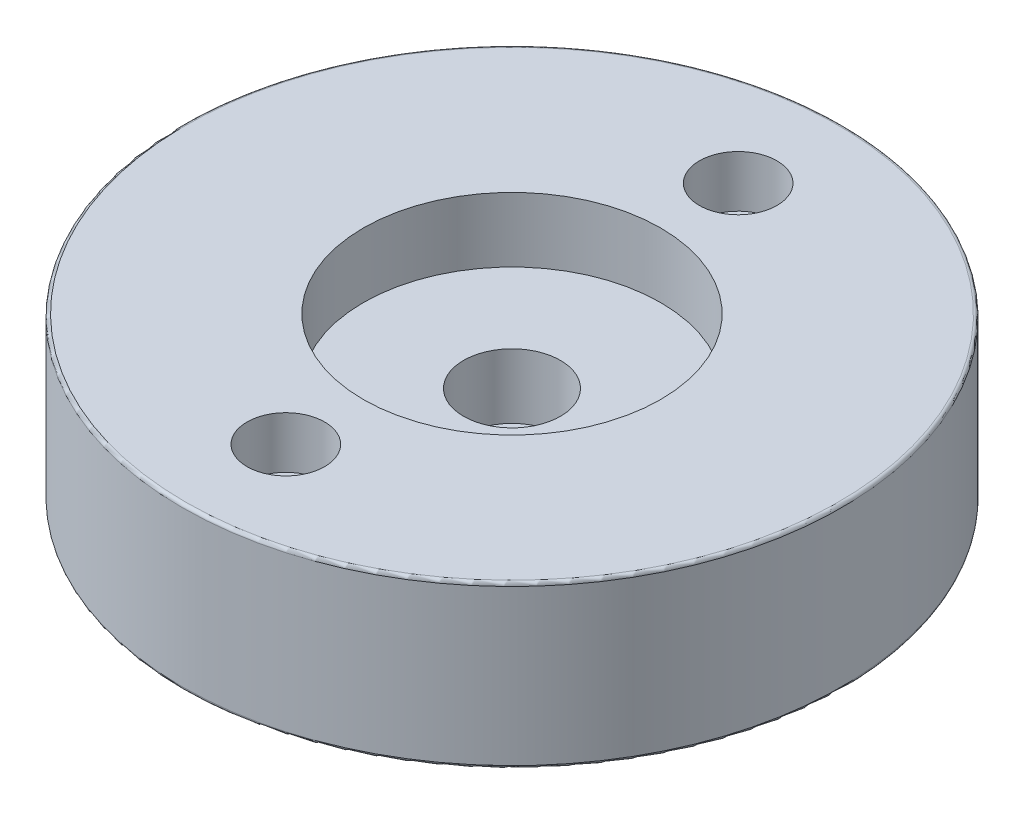
ISO-10303-21;
HEADER;
FILE_DESCRIPTION(('STEP AP214'),'2;1');
FILE_NAME('part.step','',(''),(''),'','','');
FILE_SCHEMA(('AUTOMOTIVE_DESIGN { 1 0 10303 214 1 1 1 1 }'));
ENDSEC;
DATA;
#1=APPLICATION_CONTEXT('core data for automotive mechanical design processes');
#2=APPLICATION_PROTOCOL_DEFINITION('international standard','automotive_design',2000,#1);
#3=PRODUCT_CONTEXT('',#1,'mechanical');
#4=PRODUCT('Part','Part','',(#3));
#5=PRODUCT_RELATED_PRODUCT_CATEGORY('part','',(#4));
#6=PRODUCT_DEFINITION_FORMATION('','',#4);
#7=PRODUCT_DEFINITION_CONTEXT('part definition',#1,'design');
#8=PRODUCT_DEFINITION('design','',#6,#7);
#9=PRODUCT_DEFINITION_SHAPE('','',#8);
#10=(LENGTH_UNIT() NAMED_UNIT(*) SI_UNIT(.MILLI.,.METRE.));
#11=(NAMED_UNIT(*) PLANE_ANGLE_UNIT() SI_UNIT($,.RADIAN.));
#12=(NAMED_UNIT(*) SI_UNIT($,.STERADIAN.) SOLID_ANGLE_UNIT());
#13=UNCERTAINTY_MEASURE_WITH_UNIT(LENGTH_MEASURE(1.E-05),#10,'distance_accuracy_value','');
#14=(GEOMETRIC_REPRESENTATION_CONTEXT(3) GLOBAL_UNCERTAINTY_ASSIGNED_CONTEXT((#13)) GLOBAL_UNIT_ASSIGNED_CONTEXT((#10,
#11,#12)) REPRESENTATION_CONTEXT('',''));
#15=CARTESIAN_POINT('',(0.,0.,0.));
#16=DIRECTION('',(0.,0.,1.));
#17=DIRECTION('',(1.,0.,0.));
#18=AXIS2_PLACEMENT_3D('',#15,#16,#17);
#19=CARTESIAN_POINT('',(0.,31.75,0.));
#20=DIRECTION('',(0.,-1.,0.));
#21=DIRECTION('',(0.,0.,-1.));
#22=AXIS2_PLACEMENT_3D('',#19,#20,#21);
#23=CYLINDRICAL_SURFACE('',#22,64.77);
#24=CARTESIAN_POINT('',(0.,0.635,0.));
#25=DIRECTION('',(0.,1.,0.));
#26=DIRECTION('',(0.,0.,1.));
#27=AXIS2_PLACEMENT_3D('',#24,#25,#26);
#28=CIRCLE('',#27,64.77);
#29=CARTESIAN_POINT('',(0.,0.635,64.77));
#30=VERTEX_POINT('',#29);
#31=EDGE_CURVE('E44',#30,#30,#28,.T.);
#32=ORIENTED_EDGE('',*,*,#31,.T.);
#33=EDGE_LOOP('',(#32));
#34=FACE_BOUND('',#33,.T.);
#35=CARTESIAN_POINT('',(0.,31.115,0.));
#36=DIRECTION('',(0.,1.,0.));
#37=DIRECTION('',(0.,0.,1.));
#38=AXIS2_PLACEMENT_3D('',#35,#36,#37);
#39=CIRCLE('',#38,64.77);
#40=CARTESIAN_POINT('',(0.,31.115,64.77));
#41=VERTEX_POINT('',#40);
#42=EDGE_CURVE('E48',#41,#41,#39,.F.);
#43=ORIENTED_EDGE('',*,*,#42,.T.);
#44=EDGE_LOOP('',(#43));
#45=FACE_BOUND('',#44,.T.);
#46=ADVANCED_FACE('F33',(#34,#45),#23,.T.);
#47=CARTESIAN_POINT('',(0.,31.75,0.));
#48=DIRECTION('',(0.,1.,0.));
#49=DIRECTION('',(0.,0.,1.));
#50=AXIS2_PLACEMENT_3D('',#47,#48,#49);
#51=PLANE('',#50);
#52=CARTESIAN_POINT('',(0.,31.75,44.45));
#53=DIRECTION('',(0.,1.,0.));
#54=DIRECTION('',(0.,0.,1.));
#55=AXIS2_PLACEMENT_3D('',#52,#53,#54);
#56=CIRCLE('',#55,7.62);
#57=CARTESIAN_POINT('',(0.,31.75,52.07));
#58=VERTEX_POINT('',#57);
#59=EDGE_CURVE('E72',#58,#58,#56,.T.);
#60=ORIENTED_EDGE('',*,*,#59,.F.);
#61=EDGE_LOOP('',(#60));
#62=FACE_BOUND('',#61,.T.);
#63=CARTESIAN_POINT('',(0.,31.75,-44.45));
#64=DIRECTION('',(0.,1.,0.));
#65=DIRECTION('',(0.,0.,-1.));
#66=AXIS2_PLACEMENT_3D('',#63,#64,#65);
#67=CIRCLE('',#66,7.62);
#68=CARTESIAN_POINT('',(0.,31.75,-52.07));
#69=VERTEX_POINT('',#68);
#70=EDGE_CURVE('E66',#69,#69,#67,.T.);
#71=ORIENTED_EDGE('',*,*,#70,.F.);
#72=EDGE_LOOP('',(#71));
#73=FACE_BOUND('',#72,.T.);
#74=CARTESIAN_POINT('',(0.,31.75,0.));
#75=DIRECTION('',(0.,1.,0.));
#76=DIRECTION('',(0.,0.,1.));
#77=AXIS2_PLACEMENT_3D('',#74,#75,#76);
#78=CIRCLE('',#77,29.21);
#79=CARTESIAN_POINT('',(0.,31.75,29.21));
#80=VERTEX_POINT('',#79);
#81=EDGE_CURVE('E54',#80,#80,#78,.T.);
#82=ORIENTED_EDGE('',*,*,#81,.F.);
#83=EDGE_LOOP('',(#82));
#84=FACE_BOUND('',#83,.T.);
#85=CARTESIAN_POINT('',(0.,31.75,0.));
#86=DIRECTION('',(0.,1.,0.));
#87=DIRECTION('',(0.,0.,1.));
#88=AXIS2_PLACEMENT_3D('',#85,#86,#87);
#89=CIRCLE('',#88,64.135);
#90=CARTESIAN_POINT('',(0.,31.75,64.135));
#91=VERTEX_POINT('',#90);
#92=EDGE_CURVE('E10',#91,#91,#89,.T.);
#93=ORIENTED_EDGE('',*,*,#92,.T.);
#94=EDGE_LOOP('',(#93));
#95=FACE_BOUND('',#94,.T.);
#96=ADVANCED_FACE('F87',(#62,#73,#84,#95),#51,.T.);
#97=CARTESIAN_POINT('',(0.,0.,0.));
#98=DIRECTION('',(0.,1.,0.));
#99=DIRECTION('',(0.,0.,1.));
#100=AXIS2_PLACEMENT_3D('',#97,#98,#99);
#101=PLANE('',#100);
#102=CARTESIAN_POINT('',(0.,0.,0.));
#103=DIRECTION('',(0.,1.,0.));
#104=DIRECTION('',(0.,0.,1.));
#105=AXIS2_PLACEMENT_3D('',#102,#103,#104);
#106=CIRCLE('',#105,64.135);
#107=CARTESIAN_POINT('',(0.,0.,64.135));
#108=VERTEX_POINT('',#107);
#109=EDGE_CURVE('E40',#108,#108,#106,.F.);
#110=ORIENTED_EDGE('',*,*,#109,.T.);
#111=EDGE_LOOP('',(#110));
#112=FACE_BOUND('',#111,.T.);
#113=ADVANCED_FACE('F90',(#112),#101,.F.);
#114=CARTESIAN_POINT('',(0.,0.635,0.));
#115=DIRECTION('',(0.,1.,0.));
#116=DIRECTION('',(0.,0.,1.));
#117=AXIS2_PLACEMENT_3D('',#114,#115,#116);
#118=TOROIDAL_SURFACE('',#117,64.135,0.635);
#119=ORIENTED_EDGE('',*,*,#109,.F.);
#120=EDGE_LOOP('',(#119));
#121=FACE_BOUND('',#120,.T.);
#122=ORIENTED_EDGE('',*,*,#31,.F.);
#123=EDGE_LOOP('',(#122));
#124=FACE_BOUND('',#123,.T.);
#125=ADVANCED_FACE('F108',(#121,#124),#118,.T.);
#126=CARTESIAN_POINT('',(0.,31.115,0.));
#127=DIRECTION('',(0.,1.,0.));
#128=DIRECTION('',(0.,0.,1.));
#129=AXIS2_PLACEMENT_3D('',#126,#127,#128);
#130=TOROIDAL_SURFACE('',#129,64.135,0.635);
#131=ORIENTED_EDGE('',*,*,#42,.F.);
#132=EDGE_LOOP('',(#131));
#133=FACE_BOUND('',#132,.T.);
#134=ORIENTED_EDGE('',*,*,#92,.F.);
#135=EDGE_LOOP('',(#134));
#136=FACE_BOUND('',#135,.T.);
#137=ADVANCED_FACE('F35',(#133,#136),#130,.T.);
#138=CARTESIAN_POINT('',(0.,19.05,0.));
#139=DIRECTION('',(0.,1.,0.));
#140=DIRECTION('',(0.,0.,1.));
#141=AXIS2_PLACEMENT_3D('',#138,#139,#140);
#142=CYLINDRICAL_SURFACE('',#141,29.21);
#143=CARTESIAN_POINT('',(0.,19.05,0.));
#144=DIRECTION('',(0.,1.,0.));
#145=DIRECTION('',(0.,0.,1.));
#146=AXIS2_PLACEMENT_3D('',#143,#144,#145);
#147=CIRCLE('',#146,29.21);
#148=CARTESIAN_POINT('',(0.,19.05,29.21));
#149=VERTEX_POINT('',#148);
#150=EDGE_CURVE('E53',#149,#149,#147,.T.);
#151=ORIENTED_EDGE('',*,*,#150,.F.);
#152=EDGE_LOOP('',(#151));
#153=FACE_BOUND('',#152,.T.);
#154=ORIENTED_EDGE('',*,*,#81,.T.);
#155=EDGE_LOOP('',(#154));
#156=FACE_BOUND('',#155,.T.);
#157=ADVANCED_FACE('F96',(#153,#156),#142,.F.);
#158=CARTESIAN_POINT('',(0.,19.05,0.));
#159=DIRECTION('',(0.,1.,0.));
#160=DIRECTION('',(0.,0.,1.));
#161=AXIS2_PLACEMENT_3D('',#158,#159,#160);
#162=PLANE('',#161);
#163=CARTESIAN_POINT('',(0.,19.05,0.));
#164=DIRECTION('',(0.,1.,0.));
#165=DIRECTION('',(0.,0.,1.));
#166=AXIS2_PLACEMENT_3D('',#163,#164,#165);
#167=CIRCLE('',#166,9.525);
#168=CARTESIAN_POINT('',(0.,19.05,9.525));
#169=VERTEX_POINT('',#168);
#170=EDGE_CURVE('E60',#169,#169,#167,.T.);
#171=ORIENTED_EDGE('',*,*,#170,.F.);
#172=EDGE_LOOP('',(#171));
#173=FACE_BOUND('',#172,.T.);
#174=ORIENTED_EDGE('',*,*,#150,.T.);
#175=EDGE_LOOP('',(#174));
#176=FACE_BOUND('',#175,.T.);
#177=ADVANCED_FACE('F98',(#173,#176),#162,.T.);
#178=CARTESIAN_POINT('',(0.,6.35,0.));
#179=DIRECTION('',(0.,1.,0.));
#180=DIRECTION('',(0.,0.,1.));
#181=AXIS2_PLACEMENT_3D('',#178,#179,#180);
#182=CYLINDRICAL_SURFACE('',#181,9.525);
#183=CARTESIAN_POINT('',(0.,6.35,0.));
#184=DIRECTION('',(0.,1.,0.));
#185=DIRECTION('',(0.,0.,1.));
#186=AXIS2_PLACEMENT_3D('',#183,#184,#185);
#187=CIRCLE('',#186,9.525);
#188=CARTESIAN_POINT('',(0.,6.35,9.525));
#189=VERTEX_POINT('',#188);
#190=EDGE_CURVE('E57',#189,#189,#187,.T.);
#191=ORIENTED_EDGE('',*,*,#190,.F.);
#192=EDGE_LOOP('',(#191));
#193=FACE_BOUND('',#192,.T.);
#194=ORIENTED_EDGE('',*,*,#170,.T.);
#195=EDGE_LOOP('',(#194));
#196=FACE_BOUND('',#195,.T.);
#197=ADVANCED_FACE('F105',(#193,#196),#182,.F.);
#198=CARTESIAN_POINT('',(0.,6.35,0.));
#199=DIRECTION('',(0.,1.,0.));
#200=DIRECTION('',(0.,0.,1.));
#201=AXIS2_PLACEMENT_3D('',#198,#199,#200);
#202=PLANE('',#201);
#203=ORIENTED_EDGE('',*,*,#190,.T.);
#204=EDGE_LOOP('',(#203));
#205=FACE_BOUND('',#204,.T.);
#206=ADVANCED_FACE('F138',(#205),#202,.T.);
#207=CARTESIAN_POINT('',(0.,21.59,-44.45));
#208=DIRECTION('',(0.,1.,0.));
#209=DIRECTION('',(0.,0.,1.));
#210=AXIS2_PLACEMENT_3D('',#207,#208,#209);
#211=CYLINDRICAL_SURFACE('',#210,7.62);
#212=CARTESIAN_POINT('',(0.,21.59,-44.45));
#213=DIRECTION('',(0.,1.,0.));
#214=DIRECTION('',(0.,0.,-1.));
#215=AXIS2_PLACEMENT_3D('',#212,#213,#214);
#216=CIRCLE('',#215,7.62);
#217=CARTESIAN_POINT('',(0.,21.59,-52.07));
#218=VERTEX_POINT('',#217);
#219=EDGE_CURVE('E69',#218,#218,#216,.T.);
#220=ORIENTED_EDGE('',*,*,#219,.F.);
#221=EDGE_LOOP('',(#220));
#222=FACE_BOUND('',#221,.T.);
#223=ORIENTED_EDGE('',*,*,#70,.T.);
#224=EDGE_LOOP('',(#223));
#225=FACE_BOUND('',#224,.T.);
#226=ADVANCED_FACE('F143',(#222,#225),#211,.F.);
#227=CARTESIAN_POINT('',(0.,21.59,-44.45));
#228=DIRECTION('',(0.,-1.,0.));
#229=DIRECTION('',(0.,0.,-1.));
#230=AXIS2_PLACEMENT_3D('',#227,#228,#229);
#231=PLANE('',#230);
#232=ORIENTED_EDGE('',*,*,#219,.T.);
#233=EDGE_LOOP('',(#232));
#234=FACE_BOUND('',#233,.T.);
#235=ADVANCED_FACE('F83',(#234),#231,.F.);
#236=CARTESIAN_POINT('',(0.,21.59,44.45));
#237=DIRECTION('',(0.,1.,0.));
#238=DIRECTION('',(0.,0.,1.));
#239=AXIS2_PLACEMENT_3D('',#236,#237,#238);
#240=CYLINDRICAL_SURFACE('',#239,7.62);
#241=CARTESIAN_POINT('',(0.,21.59,44.45));
#242=DIRECTION('',(0.,1.,0.));
#243=DIRECTION('',(0.,0.,1.));
#244=AXIS2_PLACEMENT_3D('',#241,#242,#243);
#245=CIRCLE('',#244,7.62);
#246=CARTESIAN_POINT('',(0.,21.59,52.07));
#247=VERTEX_POINT('',#246);
#248=EDGE_CURVE('E63',#247,#247,#245,.T.);
#249=ORIENTED_EDGE('',*,*,#248,.F.);
#250=EDGE_LOOP('',(#249));
#251=FACE_BOUND('',#250,.T.);
#252=ORIENTED_EDGE('',*,*,#59,.T.);
#253=EDGE_LOOP('',(#252));
#254=FACE_BOUND('',#253,.T.);
#255=ADVANCED_FACE('F80',(#251,#254),#240,.F.);
#256=CARTESIAN_POINT('',(0.,21.59,44.45));
#257=DIRECTION('',(0.,1.,0.));
#258=DIRECTION('',(0.,0.,1.));
#259=AXIS2_PLACEMENT_3D('',#256,#257,#258);
#260=PLANE('',#259);
#261=ORIENTED_EDGE('',*,*,#248,.T.);
#262=EDGE_LOOP('',(#261));
#263=FACE_BOUND('',#262,.T.);
#264=ADVANCED_FACE('F78',(#263),#260,.T.);
#265=CLOSED_SHELL('',(#46,#96,#113,#125,#137,#157,#177,#197,#206,#226,#235,#255,#264));
#266=MANIFOLD_SOLID_BREP('B2',#265);
#267=ADVANCED_BREP_SHAPE_REPRESENTATION('',(#18,#266),#14);
#268=SHAPE_DEFINITION_REPRESENTATION(#9,#267);
ENDSEC;
END-ISO-10303-21;
